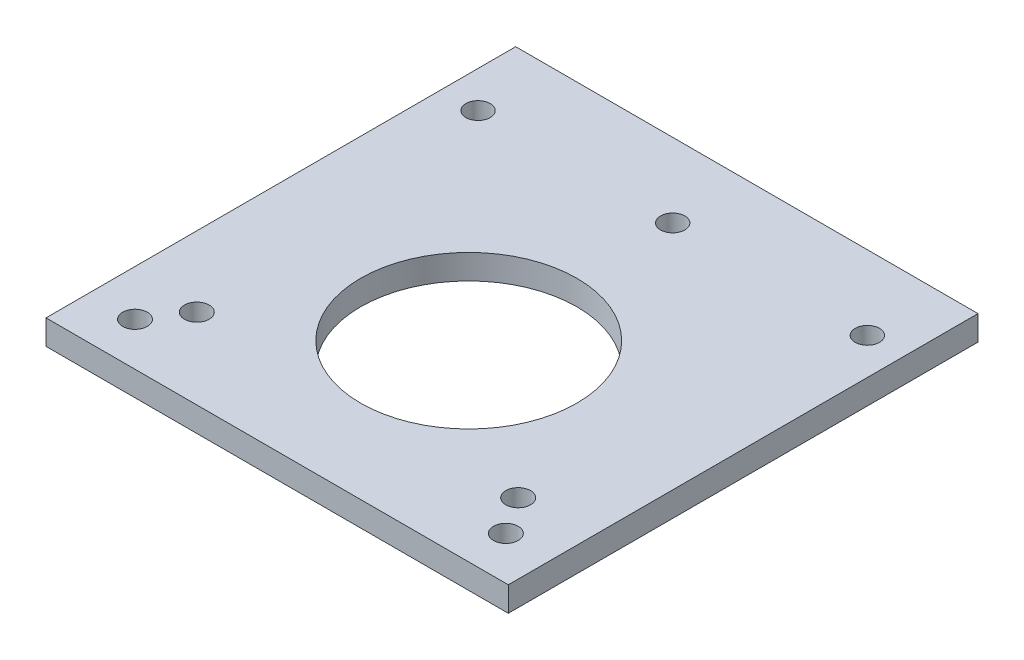
ISO-10303-21;
HEADER;
FILE_DESCRIPTION(('STEP AP214'),'2;1');
FILE_NAME('part.step','',(''),(''),'','','');
FILE_SCHEMA(('AUTOMOTIVE_DESIGN { 1 0 10303 214 1 1 1 1 }'));
ENDSEC;
DATA;
#1=APPLICATION_CONTEXT('core data for automotive mechanical design processes');
#2=APPLICATION_PROTOCOL_DEFINITION('international standard','automotive_design',2000,#1);
#3=PRODUCT_CONTEXT('',#1,'mechanical');
#4=PRODUCT('Part','Part','',(#3));
#5=PRODUCT_RELATED_PRODUCT_CATEGORY('part','',(#4));
#6=PRODUCT_DEFINITION_FORMATION('','',#4);
#7=PRODUCT_DEFINITION_CONTEXT('part definition',#1,'design');
#8=PRODUCT_DEFINITION('design','',#6,#7);
#9=PRODUCT_DEFINITION_SHAPE('','',#8);
#10=(LENGTH_UNIT() NAMED_UNIT(*) SI_UNIT(.MILLI.,.METRE.));
#11=(NAMED_UNIT(*) PLANE_ANGLE_UNIT() SI_UNIT($,.RADIAN.));
#12=(NAMED_UNIT(*) SI_UNIT($,.STERADIAN.) SOLID_ANGLE_UNIT());
#13=UNCERTAINTY_MEASURE_WITH_UNIT(LENGTH_MEASURE(1.E-05),#10,'distance_accuracy_value','');
#14=(GEOMETRIC_REPRESENTATION_CONTEXT(3) GLOBAL_UNCERTAINTY_ASSIGNED_CONTEXT((#13)) GLOBAL_UNIT_ASSIGNED_CONTEXT((#10,
#11,#12)) REPRESENTATION_CONTEXT('',''));
#15=CARTESIAN_POINT('',(0.,0.,0.));
#16=DIRECTION('',(0.,0.,1.));
#17=DIRECTION('',(1.,0.,0.));
#18=AXIS2_PLACEMENT_3D('',#15,#16,#17);
#19=CARTESIAN_POINT('',(-47.5,5.08,-35.56));
#20=DIRECTION('',(0.,0.,1.));
#21=DIRECTION('',(1.,0.,0.));
#22=AXIS2_PLACEMENT_3D('',#19,#20,#21);
#23=PLANE('',#22);
#24=DIRECTION('',(-1.,0.,0.));
#25=VECTOR('',#24,1.);
#26=CARTESIAN_POINT('',(-47.5,0.,-35.56));
#27=LINE('',#26,#25);
#28=CARTESIAN_POINT('',(47.5,0.,-35.56));
#29=VERTEX_POINT('',#28);
#30=CARTESIAN_POINT('',(-47.5,0.,-35.56));
#31=VERTEX_POINT('',#30);
#32=EDGE_CURVE('E116',#29,#31,#27,.T.);
#33=ORIENTED_EDGE('',*,*,#32,.T.);
#34=DIRECTION('',(0.,-1.,0.));
#35=VECTOR('',#34,1.);
#36=CARTESIAN_POINT('',(-47.5,5.08,-35.56));
#37=LINE('',#36,#35);
#38=CARTESIAN_POINT('',(-47.5,5.08,-35.56));
#39=VERTEX_POINT('',#38);
#40=EDGE_CURVE('E11',#39,#31,#37,.T.);
#41=ORIENTED_EDGE('',*,*,#40,.F.);
#42=DIRECTION('',(-1.,0.,0.));
#43=VECTOR('',#42,1.);
#44=CARTESIAN_POINT('',(-47.5,5.08,-35.56));
#45=LINE('',#44,#43);
#46=CARTESIAN_POINT('',(47.5,5.08,-35.56));
#47=VERTEX_POINT('',#46);
#48=EDGE_CURVE('E99',#47,#39,#45,.T.);
#49=ORIENTED_EDGE('',*,*,#48,.F.);
#50=DIRECTION('',(0.,-1.,0.));
#51=VECTOR('',#50,1.);
#52=CARTESIAN_POINT('',(47.5,5.08,-35.56));
#53=LINE('',#52,#51);
#54=EDGE_CURVE('E112',#47,#29,#53,.T.);
#55=ORIENTED_EDGE('',*,*,#54,.T.);
#56=EDGE_LOOP('',(#33,#41,#49,#55));
#57=FACE_BOUND('',#56,.T.);
#58=ADVANCED_FACE('F45',(#57),#23,.F.);
#59=CARTESIAN_POINT('',(-47.5,5.08,60.96));
#60=DIRECTION('',(1.,0.,0.));
#61=DIRECTION('',(0.,0.,-1.));
#62=AXIS2_PLACEMENT_3D('',#59,#60,#61);
#63=PLANE('',#62);
#64=DIRECTION('',(0.,0.,1.));
#65=VECTOR('',#64,1.);
#66=CARTESIAN_POINT('',(-47.5,0.,60.96));
#67=LINE('',#66,#65);
#68=CARTESIAN_POINT('',(-47.5,0.,60.96));
#69=VERTEX_POINT('',#68);
#70=EDGE_CURVE('E104',#31,#69,#67,.T.);
#71=ORIENTED_EDGE('',*,*,#70,.T.);
#72=DIRECTION('',(0.,-1.,0.));
#73=VECTOR('',#72,1.);
#74=CARTESIAN_POINT('',(-47.5,5.08,60.96));
#75=LINE('',#74,#73);
#76=CARTESIAN_POINT('',(-47.5,5.08,60.96));
#77=VERTEX_POINT('',#76);
#78=EDGE_CURVE('E55',#77,#69,#75,.T.);
#79=ORIENTED_EDGE('',*,*,#78,.F.);
#80=DIRECTION('',(0.,0.,1.));
#81=VECTOR('',#80,1.);
#82=CARTESIAN_POINT('',(-47.5,5.08,60.96));
#83=LINE('',#82,#81);
#84=EDGE_CURVE('E94',#39,#77,#83,.T.);
#85=ORIENTED_EDGE('',*,*,#84,.F.);
#86=ORIENTED_EDGE('',*,*,#40,.T.);
#87=EDGE_LOOP('',(#71,#79,#85,#86));
#88=FACE_BOUND('',#87,.T.);
#89=ADVANCED_FACE('F103',(#88),#63,.F.);
#90=CARTESIAN_POINT('',(-47.5,5.08,60.96));
#91=DIRECTION('',(0.,0.,-1.));
#92=DIRECTION('',(-1.,0.,0.));
#93=AXIS2_PLACEMENT_3D('',#90,#91,#92);
#94=PLANE('',#93);
#95=DIRECTION('',(1.,0.,0.));
#96=VECTOR('',#95,1.);
#97=CARTESIAN_POINT('',(-47.5,0.,60.96));
#98=LINE('',#97,#96);
#99=CARTESIAN_POINT('',(47.5,0.,60.96));
#100=VERTEX_POINT('',#99);
#101=EDGE_CURVE('E81',#69,#100,#98,.T.);
#102=ORIENTED_EDGE('',*,*,#101,.T.);
#103=DIRECTION('',(0.,-1.,0.));
#104=VECTOR('',#103,1.);
#105=CARTESIAN_POINT('',(47.5,5.08,60.96));
#106=LINE('',#105,#104);
#107=CARTESIAN_POINT('',(47.5,5.08,60.96));
#108=VERTEX_POINT('',#107);
#109=EDGE_CURVE('E106',#108,#100,#106,.T.);
#110=ORIENTED_EDGE('',*,*,#109,.F.);
#111=DIRECTION('',(1.,0.,0.));
#112=VECTOR('',#111,1.);
#113=CARTESIAN_POINT('',(-47.5,5.08,60.96));
#114=LINE('',#113,#112);
#115=EDGE_CURVE('E97',#77,#108,#114,.T.);
#116=ORIENTED_EDGE('',*,*,#115,.F.);
#117=ORIENTED_EDGE('',*,*,#78,.T.);
#118=EDGE_LOOP('',(#102,#110,#116,#117));
#119=FACE_BOUND('',#118,.T.);
#120=ADVANCED_FACE('F108',(#119),#94,.F.);
#121=CARTESIAN_POINT('',(47.5,5.08,60.96));
#122=DIRECTION('',(-1.,0.,0.));
#123=DIRECTION('',(0.,0.,1.));
#124=AXIS2_PLACEMENT_3D('',#121,#122,#123);
#125=PLANE('',#124);
#126=DIRECTION('',(0.,0.,-1.));
#127=VECTOR('',#126,1.);
#128=CARTESIAN_POINT('',(47.5,0.,60.96));
#129=LINE('',#128,#127);
#130=EDGE_CURVE('E87',#100,#29,#129,.T.);
#131=ORIENTED_EDGE('',*,*,#130,.T.);
#132=ORIENTED_EDGE('',*,*,#54,.F.);
#133=DIRECTION('',(0.,0.,-1.));
#134=VECTOR('',#133,1.);
#135=CARTESIAN_POINT('',(47.5,5.08,60.96));
#136=LINE('',#135,#134);
#137=EDGE_CURVE('E64',#108,#47,#136,.T.);
#138=ORIENTED_EDGE('',*,*,#137,.F.);
#139=ORIENTED_EDGE('',*,*,#109,.T.);
#140=EDGE_LOOP('',(#131,#132,#138,#139));
#141=FACE_BOUND('',#140,.T.);
#142=ADVANCED_FACE('F190',(#141),#125,.F.);
#143=CARTESIAN_POINT('',(0.,5.08,0.));
#144=DIRECTION('',(0.,1.,0.));
#145=DIRECTION('',(0.,0.,1.));
#146=AXIS2_PLACEMENT_3D('',#143,#144,#145);
#147=PLANE('',#146);
#148=CARTESIAN_POINT('',(33.02,5.08,44.45));
#149=DIRECTION('',(0.,1.,0.));
#150=DIRECTION('',(0.,0.,-1.));
#151=AXIS2_PLACEMENT_3D('',#148,#149,#150);
#152=CIRCLE('',#151,2.54);
#153=CARTESIAN_POINT('',(33.02,5.08,41.91));
#154=VERTEX_POINT('',#153);
#155=EDGE_CURVE('E301',#154,#154,#152,.T.);
#156=ORIENTED_EDGE('',*,*,#155,.F.);
#157=EDGE_LOOP('',(#156));
#158=FACE_BOUND('',#157,.T.);
#159=CARTESIAN_POINT('',(-38.1,5.08,52.07));
#160=DIRECTION('',(0.,1.,0.));
#161=DIRECTION('',(0.,0.,1.));
#162=AXIS2_PLACEMENT_3D('',#159,#160,#161);
#163=CIRCLE('',#162,2.54);
#164=CARTESIAN_POINT('',(-38.1,5.08,54.61));
#165=VERTEX_POINT('',#164);
#166=EDGE_CURVE('E303',#165,#165,#163,.T.);
#167=ORIENTED_EDGE('',*,*,#166,.F.);
#168=EDGE_LOOP('',(#167));
#169=FACE_BOUND('',#168,.T.);
#170=CARTESIAN_POINT('',(38.1,5.08,52.07));
#171=DIRECTION('',(0.,1.,0.));
#172=DIRECTION('',(0.,0.,-1.));
#173=AXIS2_PLACEMENT_3D('',#170,#171,#172);
#174=CIRCLE('',#173,2.54);
#175=CARTESIAN_POINT('',(38.1,5.08,49.53));
#176=VERTEX_POINT('',#175);
#177=EDGE_CURVE('E309',#176,#176,#174,.T.);
#178=ORIENTED_EDGE('',*,*,#177,.F.);
#179=EDGE_LOOP('',(#178));
#180=FACE_BOUND('',#179,.T.);
#181=CARTESIAN_POINT('',(-33.02,5.08,44.45));
#182=DIRECTION('',(0.,1.,0.));
#183=DIRECTION('',(0.,0.,1.));
#184=AXIS2_PLACEMENT_3D('',#181,#182,#183);
#185=CIRCLE('',#184,2.54);
#186=CARTESIAN_POINT('',(-33.02,5.08,46.99));
#187=VERTEX_POINT('',#186);
#188=EDGE_CURVE('E136',#187,#187,#185,.T.);
#189=ORIENTED_EDGE('',*,*,#188,.F.);
#190=EDGE_LOOP('',(#189));
#191=FACE_BOUND('',#190,.T.);
#192=CARTESIAN_POINT('',(-40.,5.08,-20.32));
#193=DIRECTION('',(0.,1.,0.));
#194=DIRECTION('',(0.,0.,1.));
#195=AXIS2_PLACEMENT_3D('',#192,#193,#194);
#196=CIRCLE('',#195,2.5);
#197=CARTESIAN_POINT('',(-40.,5.08,-17.82));
#198=VERTEX_POINT('',#197);
#199=EDGE_CURVE('E146',#198,#198,#196,.T.);
#200=ORIENTED_EDGE('',*,*,#199,.F.);
#201=EDGE_LOOP('',(#200));
#202=FACE_BOUND('',#201,.T.);
#203=CARTESIAN_POINT('',(40.,5.08,-20.32));
#204=DIRECTION('',(0.,1.,0.));
#205=DIRECTION('',(0.,0.,1.));
#206=AXIS2_PLACEMENT_3D('',#203,#204,#205);
#207=CIRCLE('',#206,2.5);
#208=CARTESIAN_POINT('',(40.,5.08,-17.82));
#209=VERTEX_POINT('',#208);
#210=EDGE_CURVE('E157',#209,#209,#207,.T.);
#211=ORIENTED_EDGE('',*,*,#210,.F.);
#212=EDGE_LOOP('',(#211));
#213=FACE_BOUND('',#212,.T.);
#214=CARTESIAN_POINT('',(0.,5.08,-20.32));
#215=DIRECTION('',(0.,1.,0.));
#216=DIRECTION('',(0.,0.,1.));
#217=AXIS2_PLACEMENT_3D('',#214,#215,#216);
#218=CIRCLE('',#217,2.5);
#219=CARTESIAN_POINT('',(0.,5.08,-17.82));
#220=VERTEX_POINT('',#219);
#221=EDGE_CURVE('E169',#220,#220,#218,.T.);
#222=ORIENTED_EDGE('',*,*,#221,.F.);
#223=EDGE_LOOP('',(#222));
#224=FACE_BOUND('',#223,.T.);
#225=CARTESIAN_POINT('',(0.,5.08,21.59));
#226=DIRECTION('',(0.,1.,0.));
#227=DIRECTION('',(0.,0.,1.));
#228=AXIS2_PLACEMENT_3D('',#225,#226,#227);
#229=CIRCLE('',#228,22.225);
#230=CARTESIAN_POINT('',(0.,5.08,43.815));
#231=VERTEX_POINT('',#230);
#232=EDGE_CURVE('E177',#231,#231,#229,.T.);
#233=ORIENTED_EDGE('',*,*,#232,.F.);
#234=EDGE_LOOP('',(#233));
#235=FACE_BOUND('',#234,.T.);
#236=ORIENTED_EDGE('',*,*,#48,.T.);
#237=ORIENTED_EDGE('',*,*,#84,.T.);
#238=ORIENTED_EDGE('',*,*,#115,.T.);
#239=ORIENTED_EDGE('',*,*,#137,.T.);
#240=EDGE_LOOP('',(#236,#237,#238,#239));
#241=FACE_BOUND('',#240,.T.);
#242=ADVANCED_FACE('F95',(#158,#169,#180,#191,#202,#213,#224,#235,#241),#147,.T.);
#243=CARTESIAN_POINT('',(0.,0.,0.));
#244=DIRECTION('',(0.,1.,0.));
#245=DIRECTION('',(0.,0.,1.));
#246=AXIS2_PLACEMENT_3D('',#243,#244,#245);
#247=PLANE('',#246);
#248=CARTESIAN_POINT('',(33.02,0.,44.45));
#249=DIRECTION('',(0.,1.,0.));
#250=DIRECTION('',(0.,0.,1.));
#251=AXIS2_PLACEMENT_3D('',#248,#249,#250);
#252=CIRCLE('',#251,2.54);
#253=CARTESIAN_POINT('',(33.02,0.,46.99));
#254=VERTEX_POINT('',#253);
#255=EDGE_CURVE('E48',#254,#254,#252,.T.);
#256=ORIENTED_EDGE('',*,*,#255,.T.);
#257=EDGE_LOOP('',(#256));
#258=FACE_BOUND('',#257,.T.);
#259=CARTESIAN_POINT('',(-38.1,0.,52.07));
#260=DIRECTION('',(0.,1.,0.));
#261=DIRECTION('',(0.,0.,1.));
#262=AXIS2_PLACEMENT_3D('',#259,#260,#261);
#263=CIRCLE('',#262,2.54);
#264=CARTESIAN_POINT('',(-38.1,0.,54.61));
#265=VERTEX_POINT('',#264);
#266=EDGE_CURVE('E139',#265,#265,#263,.T.);
#267=ORIENTED_EDGE('',*,*,#266,.T.);
#268=EDGE_LOOP('',(#267));
#269=FACE_BOUND('',#268,.T.);
#270=CARTESIAN_POINT('',(38.1,0.,52.07));
#271=DIRECTION('',(0.,1.,0.));
#272=DIRECTION('',(0.,0.,1.));
#273=AXIS2_PLACEMENT_3D('',#270,#271,#272);
#274=CIRCLE('',#273,2.54);
#275=CARTESIAN_POINT('',(38.1,0.,54.61));
#276=VERTEX_POINT('',#275);
#277=EDGE_CURVE('E135',#276,#276,#274,.T.);
#278=ORIENTED_EDGE('',*,*,#277,.T.);
#279=EDGE_LOOP('',(#278));
#280=FACE_BOUND('',#279,.T.);
#281=CARTESIAN_POINT('',(-33.02,0.,44.45));
#282=DIRECTION('',(0.,1.,0.));
#283=DIRECTION('',(0.,0.,1.));
#284=AXIS2_PLACEMENT_3D('',#281,#282,#283);
#285=CIRCLE('',#284,2.54);
#286=CARTESIAN_POINT('',(-33.02,0.,46.99));
#287=VERTEX_POINT('',#286);
#288=EDGE_CURVE('E131',#287,#287,#285,.T.);
#289=ORIENTED_EDGE('',*,*,#288,.T.);
#290=EDGE_LOOP('',(#289));
#291=FACE_BOUND('',#290,.T.);
#292=CARTESIAN_POINT('',(-40.,0.,-20.32));
#293=DIRECTION('',(0.,1.,0.));
#294=DIRECTION('',(0.,0.,1.));
#295=AXIS2_PLACEMENT_3D('',#292,#293,#294);
#296=CIRCLE('',#295,2.5);
#297=CARTESIAN_POINT('',(-40.,0.,-17.82));
#298=VERTEX_POINT('',#297);
#299=EDGE_CURVE('E151',#298,#298,#296,.T.);
#300=ORIENTED_EDGE('',*,*,#299,.T.);
#301=EDGE_LOOP('',(#300));
#302=FACE_BOUND('',#301,.T.);
#303=CARTESIAN_POINT('',(40.,0.,-20.32));
#304=DIRECTION('',(0.,1.,0.));
#305=DIRECTION('',(0.,0.,1.));
#306=AXIS2_PLACEMENT_3D('',#303,#304,#305);
#307=CIRCLE('',#306,2.5);
#308=CARTESIAN_POINT('',(40.,0.,-17.82));
#309=VERTEX_POINT('',#308);
#310=EDGE_CURVE('E165',#309,#309,#307,.T.);
#311=ORIENTED_EDGE('',*,*,#310,.T.);
#312=EDGE_LOOP('',(#311));
#313=FACE_BOUND('',#312,.T.);
#314=CARTESIAN_POINT('',(0.,0.,-20.32));
#315=DIRECTION('',(0.,1.,0.));
#316=DIRECTION('',(0.,0.,1.));
#317=AXIS2_PLACEMENT_3D('',#314,#315,#316);
#318=CIRCLE('',#317,2.5);
#319=CARTESIAN_POINT('',(0.,0.,-17.82));
#320=VERTEX_POINT('',#319);
#321=EDGE_CURVE('E173',#320,#320,#318,.T.);
#322=ORIENTED_EDGE('',*,*,#321,.T.);
#323=EDGE_LOOP('',(#322));
#324=FACE_BOUND('',#323,.T.);
#325=CARTESIAN_POINT('',(0.,0.,21.59));
#326=DIRECTION('',(0.,1.,0.));
#327=DIRECTION('',(0.,0.,1.));
#328=AXIS2_PLACEMENT_3D('',#325,#326,#327);
#329=CIRCLE('',#328,22.225);
#330=CARTESIAN_POINT('',(0.,0.,43.815));
#331=VERTEX_POINT('',#330);
#332=EDGE_CURVE('E120',#331,#331,#329,.T.);
#333=ORIENTED_EDGE('',*,*,#332,.T.);
#334=EDGE_LOOP('',(#333));
#335=FACE_BOUND('',#334,.T.);
#336=ORIENTED_EDGE('',*,*,#32,.F.);
#337=ORIENTED_EDGE('',*,*,#130,.F.);
#338=ORIENTED_EDGE('',*,*,#101,.F.);
#339=ORIENTED_EDGE('',*,*,#70,.F.);
#340=EDGE_LOOP('',(#336,#337,#338,#339));
#341=FACE_BOUND('',#340,.T.);
#342=ADVANCED_FACE('F189',(#258,#269,#280,#291,#302,#313,#324,#335,#341),#247,.F.);
#343=CARTESIAN_POINT('',(0.,0.,21.59));
#344=DIRECTION('',(0.,1.,0.));
#345=DIRECTION('',(0.,0.,1.));
#346=AXIS2_PLACEMENT_3D('',#343,#344,#345);
#347=CYLINDRICAL_SURFACE('',#346,22.225);
#348=ORIENTED_EDGE('',*,*,#332,.F.);
#349=EDGE_LOOP('',(#348));
#350=FACE_BOUND('',#349,.T.);
#351=ORIENTED_EDGE('',*,*,#232,.T.);
#352=EDGE_LOOP('',(#351));
#353=FACE_BOUND('',#352,.T.);
#354=ADVANCED_FACE('F186',(#350,#353),#347,.F.);
#355=CARTESIAN_POINT('',(0.,5.08,-20.32));
#356=DIRECTION('',(0.,1.,0.));
#357=DIRECTION('',(0.,0.,1.));
#358=AXIS2_PLACEMENT_3D('',#355,#356,#357);
#359=CYLINDRICAL_SURFACE('',#358,2.5);
#360=ORIENTED_EDGE('',*,*,#321,.F.);
#361=EDGE_LOOP('',(#360));
#362=FACE_BOUND('',#361,.T.);
#363=ORIENTED_EDGE('',*,*,#221,.T.);
#364=EDGE_LOOP('',(#363));
#365=FACE_BOUND('',#364,.T.);
#366=ADVANCED_FACE('F228',(#362,#365),#359,.F.);
#367=CARTESIAN_POINT('',(40.,5.08,-20.32));
#368=DIRECTION('',(0.,1.,0.));
#369=DIRECTION('',(0.,0.,1.));
#370=AXIS2_PLACEMENT_3D('',#367,#368,#369);
#371=CYLINDRICAL_SURFACE('',#370,2.5);
#372=ORIENTED_EDGE('',*,*,#310,.F.);
#373=EDGE_LOOP('',(#372));
#374=FACE_BOUND('',#373,.T.);
#375=ORIENTED_EDGE('',*,*,#210,.T.);
#376=EDGE_LOOP('',(#375));
#377=FACE_BOUND('',#376,.T.);
#378=ADVANCED_FACE('F237',(#374,#377),#371,.F.);
#379=CARTESIAN_POINT('',(-40.,5.08,-20.32));
#380=DIRECTION('',(0.,1.,0.));
#381=DIRECTION('',(0.,0.,1.));
#382=AXIS2_PLACEMENT_3D('',#379,#380,#381);
#383=CYLINDRICAL_SURFACE('',#382,2.5);
#384=ORIENTED_EDGE('',*,*,#299,.F.);
#385=EDGE_LOOP('',(#384));
#386=FACE_BOUND('',#385,.T.);
#387=ORIENTED_EDGE('',*,*,#199,.T.);
#388=EDGE_LOOP('',(#387));
#389=FACE_BOUND('',#388,.T.);
#390=ADVANCED_FACE('F245',(#386,#389),#383,.F.);
#391=CARTESIAN_POINT('',(-33.02,-2.54,44.45));
#392=DIRECTION('',(0.,1.,0.));
#393=DIRECTION('',(0.,0.,1.));
#394=AXIS2_PLACEMENT_3D('',#391,#392,#393);
#395=CYLINDRICAL_SURFACE('',#394,2.54);
#396=ORIENTED_EDGE('',*,*,#188,.T.);
#397=EDGE_LOOP('',(#396));
#398=FACE_BOUND('',#397,.T.);
#399=ORIENTED_EDGE('',*,*,#288,.F.);
#400=EDGE_LOOP('',(#399));
#401=FACE_BOUND('',#400,.T.);
#402=ADVANCED_FACE('F253',(#398,#401),#395,.F.);
#403=CARTESIAN_POINT('',(38.1,-2.54,52.07));
#404=DIRECTION('',(0.,1.,0.));
#405=DIRECTION('',(0.,0.,1.));
#406=AXIS2_PLACEMENT_3D('',#403,#404,#405);
#407=CYLINDRICAL_SURFACE('',#406,2.54);
#408=ORIENTED_EDGE('',*,*,#177,.T.);
#409=EDGE_LOOP('',(#408));
#410=FACE_BOUND('',#409,.T.);
#411=ORIENTED_EDGE('',*,*,#277,.F.);
#412=EDGE_LOOP('',(#411));
#413=FACE_BOUND('',#412,.T.);
#414=ADVANCED_FACE('F266',(#410,#413),#407,.F.);
#415=CARTESIAN_POINT('',(-38.1,-2.54,52.07));
#416=DIRECTION('',(0.,1.,0.));
#417=DIRECTION('',(0.,0.,1.));
#418=AXIS2_PLACEMENT_3D('',#415,#416,#417);
#419=CYLINDRICAL_SURFACE('',#418,2.54);
#420=ORIENTED_EDGE('',*,*,#166,.T.);
#421=EDGE_LOOP('',(#420));
#422=FACE_BOUND('',#421,.T.);
#423=ORIENTED_EDGE('',*,*,#266,.F.);
#424=EDGE_LOOP('',(#423));
#425=FACE_BOUND('',#424,.T.);
#426=ADVANCED_FACE('F276',(#422,#425),#419,.F.);
#427=CARTESIAN_POINT('',(33.02,-2.54,44.45));
#428=DIRECTION('',(0.,1.,0.));
#429=DIRECTION('',(0.,0.,1.));
#430=AXIS2_PLACEMENT_3D('',#427,#428,#429);
#431=CYLINDRICAL_SURFACE('',#430,2.54);
#432=ORIENTED_EDGE('',*,*,#155,.T.);
#433=EDGE_LOOP('',(#432));
#434=FACE_BOUND('',#433,.T.);
#435=ORIENTED_EDGE('',*,*,#255,.F.);
#436=EDGE_LOOP('',(#435));
#437=FACE_BOUND('',#436,.T.);
#438=ADVANCED_FACE('F286',(#434,#437),#431,.F.);
#439=CLOSED_SHELL('',(#58,#89,#120,#142,#242,#342,#354,#366,#378,#390,#402,#414,#426,#438));
#440=MANIFOLD_SOLID_BREP('B2',#439);
#441=ADVANCED_BREP_SHAPE_REPRESENTATION('',(#18,#440),#14);
#442=SHAPE_DEFINITION_REPRESENTATION(#9,#441);
ENDSEC;
END-ISO-10303-21;
